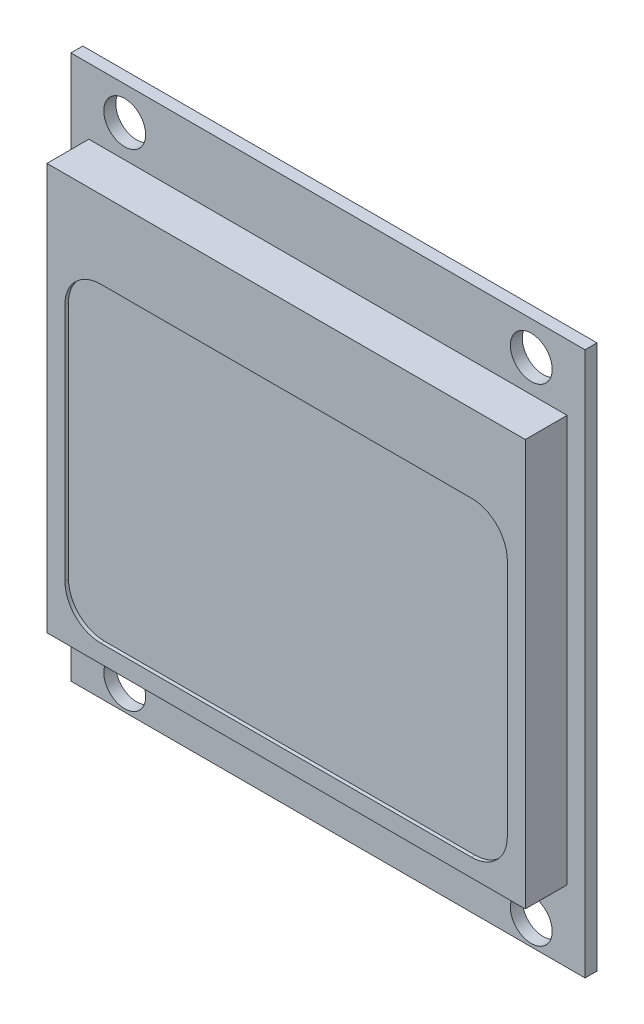
ISO-10303-21;
HEADER;
FILE_DESCRIPTION(('STEP AP214'),'2;1');
FILE_NAME('part.step','',(''),(''),'','','');
FILE_SCHEMA(('AUTOMOTIVE_DESIGN { 1 0 10303 214 1 1 1 1 }'));
ENDSEC;
DATA;
#1=APPLICATION_CONTEXT('core data for automotive mechanical design processes');
#2=APPLICATION_PROTOCOL_DEFINITION('international standard','automotive_design',2000,#1);
#3=PRODUCT_CONTEXT('',#1,'mechanical');
#4=PRODUCT('Part','Part','',(#3));
#5=PRODUCT_RELATED_PRODUCT_CATEGORY('part','',(#4));
#6=PRODUCT_DEFINITION_FORMATION('','',#4);
#7=PRODUCT_DEFINITION_CONTEXT('part definition',#1,'design');
#8=PRODUCT_DEFINITION('design','',#6,#7);
#9=PRODUCT_DEFINITION_SHAPE('','',#8);
#10=(LENGTH_UNIT() NAMED_UNIT(*) SI_UNIT(.MILLI.,.METRE.));
#11=(NAMED_UNIT(*) PLANE_ANGLE_UNIT() SI_UNIT($,.RADIAN.));
#12=(NAMED_UNIT(*) SI_UNIT($,.STERADIAN.) SOLID_ANGLE_UNIT());
#13=UNCERTAINTY_MEASURE_WITH_UNIT(LENGTH_MEASURE(1.E-05),#10,'distance_accuracy_value','');
#14=(GEOMETRIC_REPRESENTATION_CONTEXT(3) GLOBAL_UNCERTAINTY_ASSIGNED_CONTEXT((#13)) GLOBAL_UNIT_ASSIGNED_CONTEXT((#10,
#11,#12)) REPRESENTATION_CONTEXT('',''));
#15=CARTESIAN_POINT('',(0.,0.,0.));
#16=DIRECTION('',(0.,0.,1.));
#17=DIRECTION('',(1.,0.,0.));
#18=AXIS2_PLACEMENT_3D('',#15,#16,#17);
#19=CARTESIAN_POINT('',(0.,0.,1.));
#20=DIRECTION('',(0.,0.,1.));
#21=DIRECTION('',(1.,0.,0.));
#22=AXIS2_PLACEMENT_3D('',#19,#20,#21);
#23=PLANE('',#22);
#24=CARTESIAN_POINT('',(-17.,-20.75,1.));
#25=DIRECTION('',(0.,0.,1.));
#26=DIRECTION('',(1.,0.,0.));
#27=AXIS2_PLACEMENT_3D('',#24,#25,#26);
#28=CIRCLE('',#27,1.75);
#29=CARTESIAN_POINT('',(-15.25,-20.75,1.));
#30=VERTEX_POINT('',#29);
#31=EDGE_CURVE('E251',#30,#30,#28,.T.);
#32=ORIENTED_EDGE('',*,*,#31,.F.);
#33=EDGE_LOOP('',(#32));
#34=FACE_BOUND('',#33,.T.);
#35=CARTESIAN_POINT('',(-17.,19.95,1.));
#36=DIRECTION('',(0.,0.,1.));
#37=DIRECTION('',(1.,0.,0.));
#38=AXIS2_PLACEMENT_3D('',#35,#36,#37);
#39=CIRCLE('',#38,1.75);
#40=CARTESIAN_POINT('',(-15.25,19.95,1.));
#41=VERTEX_POINT('',#40);
#42=EDGE_CURVE('E263',#41,#41,#39,.T.);
#43=ORIENTED_EDGE('',*,*,#42,.F.);
#44=EDGE_LOOP('',(#43));
#45=FACE_BOUND('',#44,.T.);
#46=DIRECTION('',(0.,1.,0.));
#47=VECTOR('',#46,1.);
#48=CARTESIAN_POINT('',(21.5,22.75,1.));
#49=LINE('',#48,#47);
#50=CARTESIAN_POINT('',(21.5,-22.75,1.));
#51=VERTEX_POINT('',#50);
#52=CARTESIAN_POINT('',(21.5,22.75,1.));
#53=VERTEX_POINT('',#52);
#54=EDGE_CURVE('E269',#51,#53,#49,.T.);
#55=ORIENTED_EDGE('',*,*,#54,.T.);
#56=DIRECTION('',(-1.,0.,0.));
#57=VECTOR('',#56,1.);
#58=CARTESIAN_POINT('',(-21.5,22.75,1.));
#59=LINE('',#58,#57);
#60=CARTESIAN_POINT('',(-21.5,22.75,1.));
#61=VERTEX_POINT('',#60);
#62=EDGE_CURVE('E272',#53,#61,#59,.T.);
#63=ORIENTED_EDGE('',*,*,#62,.T.);
#64=DIRECTION('',(0.,-1.,0.));
#65=VECTOR('',#64,1.);
#66=CARTESIAN_POINT('',(-21.5,22.75,1.));
#67=LINE('',#66,#65);
#68=CARTESIAN_POINT('',(-21.5,-22.75,1.));
#69=VERTEX_POINT('',#68);
#70=EDGE_CURVE('E275',#61,#69,#67,.T.);
#71=ORIENTED_EDGE('',*,*,#70,.T.);
#72=DIRECTION('',(1.,0.,0.));
#73=VECTOR('',#72,1.);
#74=CARTESIAN_POINT('',(-21.5,-22.75,1.));
#75=LINE('',#74,#73);
#76=EDGE_CURVE('E277',#69,#51,#75,.T.);
#77=ORIENTED_EDGE('',*,*,#76,.T.);
#78=EDGE_LOOP('',(#55,#63,#71,#77));
#79=FACE_BOUND('',#78,.T.);
#80=CARTESIAN_POINT('',(17.,19.95,1.));
#81=DIRECTION('',(0.,0.,1.));
#82=DIRECTION('',(1.,0.,0.));
#83=AXIS2_PLACEMENT_3D('',#80,#81,#82);
#84=CIRCLE('',#83,1.75);
#85=CARTESIAN_POINT('',(18.75,19.95,1.));
#86=VERTEX_POINT('',#85);
#87=EDGE_CURVE('E257',#86,#86,#84,.T.);
#88=ORIENTED_EDGE('',*,*,#87,.F.);
#89=EDGE_LOOP('',(#88));
#90=FACE_BOUND('',#89,.T.);
#91=CARTESIAN_POINT('',(17.,-20.75,1.));
#92=DIRECTION('',(0.,0.,1.));
#93=DIRECTION('',(1.,0.,0.));
#94=AXIS2_PLACEMENT_3D('',#91,#92,#93);
#95=CIRCLE('',#94,1.75);
#96=CARTESIAN_POINT('',(18.75,-20.75,1.));
#97=VERTEX_POINT('',#96);
#98=EDGE_CURVE('E245',#97,#97,#95,.T.);
#99=ORIENTED_EDGE('',*,*,#98,.F.);
#100=EDGE_LOOP('',(#99));
#101=FACE_BOUND('',#100,.T.);
#102=DIRECTION('',(-1.,0.,0.));
#103=VECTOR('',#102,1.);
#104=CARTESIAN_POINT('',(-20.,17.25,1.));
#105=LINE('',#104,#103);
#106=CARTESIAN_POINT('',(20.,17.25,1.));
#107=VERTEX_POINT('',#106);
#108=CARTESIAN_POINT('',(-20.,17.25,1.));
#109=VERTEX_POINT('',#108);
#110=EDGE_CURVE('E231',#107,#109,#105,.T.);
#111=ORIENTED_EDGE('',*,*,#110,.F.);
#112=DIRECTION('',(0.,1.,0.));
#113=VECTOR('',#112,1.);
#114=CARTESIAN_POINT('',(20.,17.25,1.));
#115=LINE('',#114,#113);
#116=CARTESIAN_POINT('',(20.,-16.75,1.));
#117=VERTEX_POINT('',#116);
#118=EDGE_CURVE('E206',#117,#107,#115,.T.);
#119=ORIENTED_EDGE('',*,*,#118,.F.);
#120=DIRECTION('',(1.,0.,0.));
#121=VECTOR('',#120,1.);
#122=CARTESIAN_POINT('',(-20.,-16.75,1.));
#123=LINE('',#122,#121);
#124=CARTESIAN_POINT('',(-20.,-16.75,1.));
#125=VERTEX_POINT('',#124);
#126=EDGE_CURVE('E222',#125,#117,#123,.T.);
#127=ORIENTED_EDGE('',*,*,#126,.F.);
#128=DIRECTION('',(0.,-1.,0.));
#129=VECTOR('',#128,1.);
#130=CARTESIAN_POINT('',(-20.,17.25,1.));
#131=LINE('',#130,#129);
#132=EDGE_CURVE('E233',#109,#125,#131,.T.);
#133=ORIENTED_EDGE('',*,*,#132,.F.);
#134=EDGE_LOOP('',(#111,#119,#127,#133));
#135=FACE_BOUND('',#134,.T.);
#136=ADVANCED_FACE('F33',(#34,#45,#79,#90,#101,#135),#23,.T.);
#137=CARTESIAN_POINT('',(0.,0.,0.));
#138=DIRECTION('',(0.,0.,1.));
#139=DIRECTION('',(1.,0.,0.));
#140=AXIS2_PLACEMENT_3D('',#137,#138,#139);
#141=PLANE('',#140);
#142=DIRECTION('',(0.,1.,0.));
#143=VECTOR('',#142,1.);
#144=CARTESIAN_POINT('',(21.5,22.75,0.));
#145=LINE('',#144,#143);
#146=CARTESIAN_POINT('',(21.5,-22.75,0.));
#147=VERTEX_POINT('',#146);
#148=CARTESIAN_POINT('',(21.5,22.75,0.));
#149=VERTEX_POINT('',#148);
#150=EDGE_CURVE('E266',#147,#149,#145,.T.);
#151=ORIENTED_EDGE('',*,*,#150,.F.);
#152=DIRECTION('',(1.,0.,0.));
#153=VECTOR('',#152,1.);
#154=CARTESIAN_POINT('',(-21.5,-22.75,0.));
#155=LINE('',#154,#153);
#156=CARTESIAN_POINT('',(-21.5,-22.75,0.));
#157=VERTEX_POINT('',#156);
#158=EDGE_CURVE('E273',#157,#147,#155,.T.);
#159=ORIENTED_EDGE('',*,*,#158,.F.);
#160=DIRECTION('',(0.,-1.,0.));
#161=VECTOR('',#160,1.);
#162=CARTESIAN_POINT('',(-21.5,22.75,0.));
#163=LINE('',#162,#161);
#164=CARTESIAN_POINT('',(-21.5,22.75,0.));
#165=VERTEX_POINT('',#164);
#166=EDGE_CURVE('E284',#165,#157,#163,.T.);
#167=ORIENTED_EDGE('',*,*,#166,.F.);
#168=DIRECTION('',(-1.,0.,0.));
#169=VECTOR('',#168,1.);
#170=CARTESIAN_POINT('',(-21.5,22.75,0.));
#171=LINE('',#170,#169);
#172=EDGE_CURVE('E282',#149,#165,#171,.T.);
#173=ORIENTED_EDGE('',*,*,#172,.F.);
#174=EDGE_LOOP('',(#151,#159,#167,#173));
#175=FACE_BOUND('',#174,.T.);
#176=CARTESIAN_POINT('',(-17.,19.95,0.));
#177=DIRECTION('',(0.,0.,1.));
#178=DIRECTION('',(1.,0.,0.));
#179=AXIS2_PLACEMENT_3D('',#176,#177,#178);
#180=CIRCLE('',#179,1.75);
#181=CARTESIAN_POINT('',(-15.25,19.95,0.));
#182=VERTEX_POINT('',#181);
#183=EDGE_CURVE('E260',#182,#182,#180,.T.);
#184=ORIENTED_EDGE('',*,*,#183,.T.);
#185=EDGE_LOOP('',(#184));
#186=FACE_BOUND('',#185,.T.);
#187=CARTESIAN_POINT('',(17.,19.95,0.));
#188=DIRECTION('',(0.,0.,1.));
#189=DIRECTION('',(1.,0.,0.));
#190=AXIS2_PLACEMENT_3D('',#187,#188,#189);
#191=CIRCLE('',#190,1.75);
#192=CARTESIAN_POINT('',(18.75,19.95,0.));
#193=VERTEX_POINT('',#192);
#194=EDGE_CURVE('E254',#193,#193,#191,.T.);
#195=ORIENTED_EDGE('',*,*,#194,.T.);
#196=EDGE_LOOP('',(#195));
#197=FACE_BOUND('',#196,.T.);
#198=CARTESIAN_POINT('',(-17.,-20.75,0.));
#199=DIRECTION('',(0.,0.,1.));
#200=DIRECTION('',(1.,0.,0.));
#201=AXIS2_PLACEMENT_3D('',#198,#199,#200);
#202=CIRCLE('',#201,1.75);
#203=CARTESIAN_POINT('',(-15.25,-20.75,0.));
#204=VERTEX_POINT('',#203);
#205=EDGE_CURVE('E248',#204,#204,#202,.T.);
#206=ORIENTED_EDGE('',*,*,#205,.T.);
#207=EDGE_LOOP('',(#206));
#208=FACE_BOUND('',#207,.T.);
#209=CARTESIAN_POINT('',(17.,-20.75,0.));
#210=DIRECTION('',(0.,0.,1.));
#211=DIRECTION('',(1.,0.,0.));
#212=AXIS2_PLACEMENT_3D('',#209,#210,#211);
#213=CIRCLE('',#212,1.75);
#214=CARTESIAN_POINT('',(18.75,-20.75,0.));
#215=VERTEX_POINT('',#214);
#216=EDGE_CURVE('E244',#215,#215,#213,.T.);
#217=ORIENTED_EDGE('',*,*,#216,.T.);
#218=EDGE_LOOP('',(#217));
#219=FACE_BOUND('',#218,.T.);
#220=ADVANCED_FACE('F302',(#175,#186,#197,#208,#219),#141,.F.);
#221=CARTESIAN_POINT('',(21.5,22.75,1.));
#222=DIRECTION('',(-1.,0.,0.));
#223=DIRECTION('',(0.,-1.,0.));
#224=AXIS2_PLACEMENT_3D('',#221,#222,#223);
#225=PLANE('',#224);
#226=ORIENTED_EDGE('',*,*,#150,.T.);
#227=DIRECTION('',(0.,0.,-1.));
#228=VECTOR('',#227,1.);
#229=CARTESIAN_POINT('',(21.5,22.75,1.));
#230=LINE('',#229,#228);
#231=EDGE_CURVE('E11',#53,#149,#230,.T.);
#232=ORIENTED_EDGE('',*,*,#231,.F.);
#233=ORIENTED_EDGE('',*,*,#54,.F.);
#234=DIRECTION('',(0.,0.,-1.));
#235=VECTOR('',#234,1.);
#236=CARTESIAN_POINT('',(21.5,-22.75,1.));
#237=LINE('',#236,#235);
#238=EDGE_CURVE('E279',#51,#147,#237,.T.);
#239=ORIENTED_EDGE('',*,*,#238,.T.);
#240=EDGE_LOOP('',(#226,#232,#233,#239));
#241=FACE_BOUND('',#240,.T.);
#242=ADVANCED_FACE('F35',(#241),#225,.F.);
#243=CARTESIAN_POINT('',(-21.5,22.75,1.));
#244=DIRECTION('',(0.,-1.,0.));
#245=DIRECTION('',(0.,0.,-1.));
#246=AXIS2_PLACEMENT_3D('',#243,#244,#245);
#247=PLANE('',#246);
#248=ORIENTED_EDGE('',*,*,#172,.T.);
#249=DIRECTION('',(0.,0.,-1.));
#250=VECTOR('',#249,1.);
#251=CARTESIAN_POINT('',(-21.5,22.75,1.));
#252=LINE('',#251,#250);
#253=EDGE_CURVE('E41',#61,#165,#252,.T.);
#254=ORIENTED_EDGE('',*,*,#253,.F.);
#255=ORIENTED_EDGE('',*,*,#62,.F.);
#256=ORIENTED_EDGE('',*,*,#231,.T.);
#257=EDGE_LOOP('',(#248,#254,#255,#256));
#258=FACE_BOUND('',#257,.T.);
#259=ADVANCED_FACE('F313',(#258),#247,.F.);
#260=CARTESIAN_POINT('',(-21.5,22.75,1.));
#261=DIRECTION('',(1.,0.,0.));
#262=DIRECTION('',(0.,1.,0.));
#263=AXIS2_PLACEMENT_3D('',#260,#261,#262);
#264=PLANE('',#263);
#265=ORIENTED_EDGE('',*,*,#166,.T.);
#266=DIRECTION('',(0.,0.,-1.));
#267=VECTOR('',#266,1.);
#268=CARTESIAN_POINT('',(-21.5,-22.75,1.));
#269=LINE('',#268,#267);
#270=EDGE_CURVE('E289',#69,#157,#269,.T.);
#271=ORIENTED_EDGE('',*,*,#270,.F.);
#272=ORIENTED_EDGE('',*,*,#70,.F.);
#273=ORIENTED_EDGE('',*,*,#253,.T.);
#274=EDGE_LOOP('',(#265,#271,#272,#273));
#275=FACE_BOUND('',#274,.T.);
#276=ADVANCED_FACE('F296',(#275),#264,.F.);
#277=CARTESIAN_POINT('',(-21.5,-22.75,1.));
#278=DIRECTION('',(0.,1.,0.));
#279=DIRECTION('',(0.,0.,1.));
#280=AXIS2_PLACEMENT_3D('',#277,#278,#279);
#281=PLANE('',#280);
#282=ORIENTED_EDGE('',*,*,#158,.T.);
#283=ORIENTED_EDGE('',*,*,#238,.F.);
#284=ORIENTED_EDGE('',*,*,#76,.F.);
#285=ORIENTED_EDGE('',*,*,#270,.T.);
#286=EDGE_LOOP('',(#282,#283,#284,#285));
#287=FACE_BOUND('',#286,.T.);
#288=ADVANCED_FACE('F306',(#287),#281,.F.);
#289=CARTESIAN_POINT('',(-17.,19.95,1.));
#290=DIRECTION('',(0.,0.,-1.));
#291=DIRECTION('',(-1.,0.,0.));
#292=AXIS2_PLACEMENT_3D('',#289,#290,#291);
#293=CYLINDRICAL_SURFACE('',#292,1.75);
#294=ORIENTED_EDGE('',*,*,#42,.T.);
#295=EDGE_LOOP('',(#294));
#296=FACE_BOUND('',#295,.T.);
#297=ORIENTED_EDGE('',*,*,#183,.F.);
#298=EDGE_LOOP('',(#297));
#299=FACE_BOUND('',#298,.T.);
#300=ADVANCED_FACE('F330',(#296,#299),#293,.F.);
#301=CARTESIAN_POINT('',(17.,19.95,1.));
#302=DIRECTION('',(0.,0.,-1.));
#303=DIRECTION('',(-1.,0.,0.));
#304=AXIS2_PLACEMENT_3D('',#301,#302,#303);
#305=CYLINDRICAL_SURFACE('',#304,1.75);
#306=ORIENTED_EDGE('',*,*,#87,.T.);
#307=EDGE_LOOP('',(#306));
#308=FACE_BOUND('',#307,.T.);
#309=ORIENTED_EDGE('',*,*,#194,.F.);
#310=EDGE_LOOP('',(#309));
#311=FACE_BOUND('',#310,.T.);
#312=ADVANCED_FACE('F337',(#308,#311),#305,.F.);
#313=CARTESIAN_POINT('',(-17.,-20.75,1.));
#314=DIRECTION('',(0.,0.,-1.));
#315=DIRECTION('',(-1.,0.,0.));
#316=AXIS2_PLACEMENT_3D('',#313,#314,#315);
#317=CYLINDRICAL_SURFACE('',#316,1.75);
#318=ORIENTED_EDGE('',*,*,#31,.T.);
#319=EDGE_LOOP('',(#318));
#320=FACE_BOUND('',#319,.T.);
#321=ORIENTED_EDGE('',*,*,#205,.F.);
#322=EDGE_LOOP('',(#321));
#323=FACE_BOUND('',#322,.T.);
#324=ADVANCED_FACE('F342',(#320,#323),#317,.F.);
#325=CARTESIAN_POINT('',(17.,-20.75,1.));
#326=DIRECTION('',(0.,0.,-1.));
#327=DIRECTION('',(-1.,0.,0.));
#328=AXIS2_PLACEMENT_3D('',#325,#326,#327);
#329=CYLINDRICAL_SURFACE('',#328,1.75);
#330=ORIENTED_EDGE('',*,*,#98,.T.);
#331=EDGE_LOOP('',(#330));
#332=FACE_BOUND('',#331,.T.);
#333=ORIENTED_EDGE('',*,*,#216,.F.);
#334=EDGE_LOOP('',(#333));
#335=FACE_BOUND('',#334,.T.);
#336=ADVANCED_FACE('F354',(#332,#335),#329,.F.);
#337=CARTESIAN_POINT('',(20.,17.25,4.5));
#338=DIRECTION('',(-1.,0.,0.));
#339=DIRECTION('',(0.,-1.,0.));
#340=AXIS2_PLACEMENT_3D('',#337,#338,#339);
#341=PLANE('',#340);
#342=ORIENTED_EDGE('',*,*,#118,.T.);
#343=DIRECTION('',(0.,0.,-1.));
#344=VECTOR('',#343,1.);
#345=CARTESIAN_POINT('',(20.,17.25,4.5));
#346=LINE('',#345,#344);
#347=CARTESIAN_POINT('',(20.,17.25,4.5));
#348=VERTEX_POINT('',#347);
#349=EDGE_CURVE('E242',#348,#107,#346,.T.);
#350=ORIENTED_EDGE('',*,*,#349,.F.);
#351=DIRECTION('',(0.,1.,0.));
#352=VECTOR('',#351,1.);
#353=CARTESIAN_POINT('',(20.,17.25,4.5));
#354=LINE('',#353,#352);
#355=CARTESIAN_POINT('',(20.,-16.75,4.5));
#356=VERTEX_POINT('',#355);
#357=EDGE_CURVE('E218',#356,#348,#354,.T.);
#358=ORIENTED_EDGE('',*,*,#357,.F.);
#359=DIRECTION('',(0.,0.,-1.));
#360=VECTOR('',#359,1.);
#361=CARTESIAN_POINT('',(20.,-16.75,4.5));
#362=LINE('',#361,#360);
#363=EDGE_CURVE('E228',#356,#117,#362,.T.);
#364=ORIENTED_EDGE('',*,*,#363,.T.);
#365=EDGE_LOOP('',(#342,#350,#358,#364));
#366=FACE_BOUND('',#365,.T.);
#367=ADVANCED_FACE('F356',(#366),#341,.F.);
#368=CARTESIAN_POINT('',(-20.,17.25,4.5));
#369=DIRECTION('',(0.,-1.,0.));
#370=DIRECTION('',(0.,0.,-1.));
#371=AXIS2_PLACEMENT_3D('',#368,#369,#370);
#372=PLANE('',#371);
#373=ORIENTED_EDGE('',*,*,#110,.T.);
#374=DIRECTION('',(0.,0.,-1.));
#375=VECTOR('',#374,1.);
#376=CARTESIAN_POINT('',(-20.,17.25,4.5));
#377=LINE('',#376,#375);
#378=CARTESIAN_POINT('',(-20.,17.25,4.5));
#379=VERTEX_POINT('',#378);
#380=EDGE_CURVE('E239',#379,#109,#377,.T.);
#381=ORIENTED_EDGE('',*,*,#380,.F.);
#382=DIRECTION('',(-1.,0.,0.));
#383=VECTOR('',#382,1.);
#384=CARTESIAN_POINT('',(-20.,17.25,4.5));
#385=LINE('',#384,#383);
#386=EDGE_CURVE('E221',#348,#379,#385,.T.);
#387=ORIENTED_EDGE('',*,*,#386,.F.);
#388=ORIENTED_EDGE('',*,*,#349,.T.);
#389=EDGE_LOOP('',(#373,#381,#387,#388));
#390=FACE_BOUND('',#389,.T.);
#391=ADVANCED_FACE('F363',(#390),#372,.F.);
#392=CARTESIAN_POINT('',(-20.,17.25,4.5));
#393=DIRECTION('',(1.,0.,0.));
#394=DIRECTION('',(0.,1.,0.));
#395=AXIS2_PLACEMENT_3D('',#392,#393,#394);
#396=PLANE('',#395);
#397=ORIENTED_EDGE('',*,*,#132,.T.);
#398=DIRECTION('',(0.,0.,-1.));
#399=VECTOR('',#398,1.);
#400=CARTESIAN_POINT('',(-20.,-16.75,4.5));
#401=LINE('',#400,#399);
#402=CARTESIAN_POINT('',(-20.,-16.75,4.5));
#403=VERTEX_POINT('',#402);
#404=EDGE_CURVE('E56',#403,#125,#401,.T.);
#405=ORIENTED_EDGE('',*,*,#404,.F.);
#406=DIRECTION('',(0.,-1.,0.));
#407=VECTOR('',#406,1.);
#408=CARTESIAN_POINT('',(-20.,17.25,4.5));
#409=LINE('',#408,#407);
#410=EDGE_CURVE('E224',#379,#403,#409,.T.);
#411=ORIENTED_EDGE('',*,*,#410,.F.);
#412=ORIENTED_EDGE('',*,*,#380,.T.);
#413=EDGE_LOOP('',(#397,#405,#411,#412));
#414=FACE_BOUND('',#413,.T.);
#415=ADVANCED_FACE('F371',(#414),#396,.F.);
#416=CARTESIAN_POINT('',(-20.,-16.75,4.5));
#417=DIRECTION('',(0.,1.,0.));
#418=DIRECTION('',(0.,0.,1.));
#419=AXIS2_PLACEMENT_3D('',#416,#417,#418);
#420=PLANE('',#419);
#421=ORIENTED_EDGE('',*,*,#126,.T.);
#422=ORIENTED_EDGE('',*,*,#363,.F.);
#423=DIRECTION('',(1.,0.,0.));
#424=VECTOR('',#423,1.);
#425=CARTESIAN_POINT('',(-20.,-16.75,4.5));
#426=LINE('',#425,#424);
#427=EDGE_CURVE('E226',#403,#356,#426,.T.);
#428=ORIENTED_EDGE('',*,*,#427,.F.);
#429=ORIENTED_EDGE('',*,*,#404,.T.);
#430=EDGE_LOOP('',(#421,#422,#428,#429));
#431=FACE_BOUND('',#430,.T.);
#432=ADVANCED_FACE('F375',(#431),#420,.F.);
#433=CARTESIAN_POINT('',(0.,0.,4.5));
#434=DIRECTION('',(0.,0.,1.));
#435=DIRECTION('',(1.,0.,0.));
#436=AXIS2_PLACEMENT_3D('',#433,#434,#435);
#437=PLANE('',#436);
#438=CARTESIAN_POINT('',(-15.5,-12.25,4.5));
#439=DIRECTION('',(0.,0.,1.));
#440=DIRECTION('',(1.,0.,0.));
#441=AXIS2_PLACEMENT_3D('',#438,#439,#440);
#442=CIRCLE('',#441,3.);
#443=CARTESIAN_POINT('',(-18.5,-12.25,4.5));
#444=VERTEX_POINT('',#443);
#445=CARTESIAN_POINT('',(-15.5,-15.25,4.5));
#446=VERTEX_POINT('',#445);
#447=EDGE_CURVE('E48',#444,#446,#442,.T.);
#448=ORIENTED_EDGE('',*,*,#447,.F.);
#449=DIRECTION('',(0.,-1.,0.));
#450=VECTOR('',#449,1.);
#451=CARTESIAN_POINT('',(-18.5,7.74999999999998,4.5));
#452=LINE('',#451,#450);
#453=CARTESIAN_POINT('',(-18.5,7.74999999999998,4.5));
#454=VERTEX_POINT('',#453);
#455=EDGE_CURVE('E168',#454,#444,#452,.T.);
#456=ORIENTED_EDGE('',*,*,#455,.F.);
#457=CARTESIAN_POINT('',(-15.5,7.75,4.5));
#458=DIRECTION('',(0.,0.,1.));
#459=DIRECTION('',(1.,0.,0.));
#460=AXIS2_PLACEMENT_3D('',#457,#458,#459);
#461=CIRCLE('',#460,3.);
#462=CARTESIAN_POINT('',(-15.5,10.75,4.5));
#463=VERTEX_POINT('',#462);
#464=EDGE_CURVE('E171',#463,#454,#461,.T.);
#465=ORIENTED_EDGE('',*,*,#464,.F.);
#466=DIRECTION('',(-1.,0.,0.));
#467=VECTOR('',#466,1.);
#468=CARTESIAN_POINT('',(-15.5,10.75,4.5));
#469=LINE('',#468,#467);
#470=CARTESIAN_POINT('',(15.5,10.75,4.5));
#471=VERTEX_POINT('',#470);
#472=EDGE_CURVE('E199',#471,#463,#469,.T.);
#473=ORIENTED_EDGE('',*,*,#472,.F.);
#474=CARTESIAN_POINT('',(15.5,7.75,4.5));
#475=DIRECTION('',(0.,0.,1.));
#476=DIRECTION('',(-1.,0.,0.));
#477=AXIS2_PLACEMENT_3D('',#474,#475,#476);
#478=CIRCLE('',#477,3.);
#479=CARTESIAN_POINT('',(18.5,7.74999999999998,4.5));
#480=VERTEX_POINT('',#479);
#481=EDGE_CURVE('E196',#480,#471,#478,.T.);
#482=ORIENTED_EDGE('',*,*,#481,.F.);
#483=DIRECTION('',(0.,1.,0.));
#484=VECTOR('',#483,1.);
#485=CARTESIAN_POINT('',(18.5,7.74999999999998,4.5));
#486=LINE('',#485,#484);
#487=CARTESIAN_POINT('',(18.5,-12.25,4.5));
#488=VERTEX_POINT('',#487);
#489=EDGE_CURVE('E193',#488,#480,#486,.T.);
#490=ORIENTED_EDGE('',*,*,#489,.F.);
#491=CARTESIAN_POINT('',(15.5,-12.25,4.5));
#492=DIRECTION('',(0.,0.,1.));
#493=DIRECTION('',(1.,0.,0.));
#494=AXIS2_PLACEMENT_3D('',#491,#492,#493);
#495=CIRCLE('',#494,3.);
#496=CARTESIAN_POINT('',(15.5,-15.25,4.5));
#497=VERTEX_POINT('',#496);
#498=EDGE_CURVE('E190',#497,#488,#495,.T.);
#499=ORIENTED_EDGE('',*,*,#498,.F.);
#500=DIRECTION('',(1.,0.,0.));
#501=VECTOR('',#500,1.);
#502=CARTESIAN_POINT('',(-15.5,-15.25,4.5));
#503=LINE('',#502,#501);
#504=EDGE_CURVE('E188',#446,#497,#503,.T.);
#505=ORIENTED_EDGE('',*,*,#504,.F.);
#506=EDGE_LOOP('',(#448,#456,#465,#473,#482,#490,#499,#505));
#507=FACE_BOUND('',#506,.T.);
#508=ORIENTED_EDGE('',*,*,#357,.T.);
#509=ORIENTED_EDGE('',*,*,#386,.T.);
#510=ORIENTED_EDGE('',*,*,#410,.T.);
#511=ORIENTED_EDGE('',*,*,#427,.T.);
#512=EDGE_LOOP('',(#508,#509,#510,#511));
#513=FACE_BOUND('',#512,.T.);
#514=ADVANCED_FACE('F379',(#507,#513),#437,.T.);
#515=CARTESIAN_POINT('',(-15.5,-12.25,4.2));
#516=DIRECTION('',(0.,0.,1.));
#517=DIRECTION('',(1.,0.,0.));
#518=AXIS2_PLACEMENT_3D('',#515,#516,#517);
#519=CYLINDRICAL_SURFACE('',#518,3.);
#520=ORIENTED_EDGE('',*,*,#447,.T.);
#521=DIRECTION('',(0.,0.,1.));
#522=VECTOR('',#521,1.);
#523=CARTESIAN_POINT('',(-15.5,-15.25,4.2));
#524=LINE('',#523,#522);
#525=CARTESIAN_POINT('',(-15.5,-15.25,4.2));
#526=VERTEX_POINT('',#525);
#527=EDGE_CURVE('E145',#526,#446,#524,.T.);
#528=ORIENTED_EDGE('',*,*,#527,.F.);
#529=CARTESIAN_POINT('',(-15.5,-12.25,4.2));
#530=DIRECTION('',(0.,0.,1.));
#531=DIRECTION('',(1.,0.,0.));
#532=AXIS2_PLACEMENT_3D('',#529,#530,#531);
#533=CIRCLE('',#532,3.);
#534=CARTESIAN_POINT('',(-18.5,-12.25,4.2));
#535=VERTEX_POINT('',#534);
#536=EDGE_CURVE('E149',#535,#526,#533,.T.);
#537=ORIENTED_EDGE('',*,*,#536,.F.);
#538=DIRECTION('',(0.,0.,1.));
#539=VECTOR('',#538,1.);
#540=CARTESIAN_POINT('',(-18.5,-12.25,4.2));
#541=LINE('',#540,#539);
#542=EDGE_CURVE('E204',#535,#444,#541,.T.);
#543=ORIENTED_EDGE('',*,*,#542,.T.);
#544=EDGE_LOOP('',(#520,#528,#537,#543));
#545=FACE_BOUND('',#544,.T.);
#546=ADVANCED_FACE('F147',(#545),#519,.F.);
#547=CARTESIAN_POINT('',(-18.5,7.74999999999998,4.2));
#548=DIRECTION('',(-1.,0.,0.));
#549=DIRECTION('',(0.,-1.,0.));
#550=AXIS2_PLACEMENT_3D('',#547,#548,#549);
#551=PLANE('',#550);
#552=ORIENTED_EDGE('',*,*,#455,.T.);
#553=ORIENTED_EDGE('',*,*,#542,.F.);
#554=DIRECTION('',(0.,-1.,0.));
#555=VECTOR('',#554,1.);
#556=CARTESIAN_POINT('',(-18.5,7.74999999999998,4.2));
#557=LINE('',#556,#555);
#558=CARTESIAN_POINT('',(-18.5,7.74999999999998,4.2));
#559=VERTEX_POINT('',#558);
#560=EDGE_CURVE('E155',#559,#535,#557,.T.);
#561=ORIENTED_EDGE('',*,*,#560,.F.);
#562=DIRECTION('',(0.,0.,1.));
#563=VECTOR('',#562,1.);
#564=CARTESIAN_POINT('',(-18.5,7.74999999999998,4.2));
#565=LINE('',#564,#563);
#566=EDGE_CURVE('E207',#559,#454,#565,.T.);
#567=ORIENTED_EDGE('',*,*,#566,.T.);
#568=EDGE_LOOP('',(#552,#553,#561,#567));
#569=FACE_BOUND('',#568,.T.);
#570=ADVANCED_FACE('F385',(#569),#551,.F.);
#571=CARTESIAN_POINT('',(-15.5,7.75,4.2));
#572=DIRECTION('',(0.,0.,1.));
#573=DIRECTION('',(1.,0.,0.));
#574=AXIS2_PLACEMENT_3D('',#571,#572,#573);
#575=CYLINDRICAL_SURFACE('',#574,3.);
#576=ORIENTED_EDGE('',*,*,#464,.T.);
#577=ORIENTED_EDGE('',*,*,#566,.F.);
#578=CARTESIAN_POINT('',(-15.5,7.75,4.2));
#579=DIRECTION('',(0.,0.,1.));
#580=DIRECTION('',(1.,0.,0.));
#581=AXIS2_PLACEMENT_3D('',#578,#579,#580);
#582=CIRCLE('',#581,3.);
#583=CARTESIAN_POINT('',(-15.5,10.75,4.2));
#584=VERTEX_POINT('',#583);
#585=EDGE_CURVE('E184',#584,#559,#582,.T.);
#586=ORIENTED_EDGE('',*,*,#585,.F.);
#587=DIRECTION('',(0.,0.,1.));
#588=VECTOR('',#587,1.);
#589=CARTESIAN_POINT('',(-15.5,10.75,4.2));
#590=LINE('',#589,#588);
#591=EDGE_CURVE('E209',#584,#463,#590,.T.);
#592=ORIENTED_EDGE('',*,*,#591,.T.);
#593=EDGE_LOOP('',(#576,#577,#586,#592));
#594=FACE_BOUND('',#593,.T.);
#595=ADVANCED_FACE('F403',(#594),#575,.F.);
#596=CARTESIAN_POINT('',(-15.5,10.75,4.2));
#597=DIRECTION('',(0.,1.,0.));
#598=DIRECTION('',(0.,0.,1.));
#599=AXIS2_PLACEMENT_3D('',#596,#597,#598);
#600=PLANE('',#599);
#601=ORIENTED_EDGE('',*,*,#472,.T.);
#602=ORIENTED_EDGE('',*,*,#591,.F.);
#603=DIRECTION('',(-1.,0.,0.));
#604=VECTOR('',#603,1.);
#605=CARTESIAN_POINT('',(-15.5,10.75,4.2));
#606=LINE('',#605,#604);
#607=CARTESIAN_POINT('',(15.5,10.75,4.2));
#608=VERTEX_POINT('',#607);
#609=EDGE_CURVE('E181',#608,#584,#606,.T.);
#610=ORIENTED_EDGE('',*,*,#609,.F.);
#611=DIRECTION('',(0.,0.,1.));
#612=VECTOR('',#611,1.);
#613=CARTESIAN_POINT('',(15.5,10.75,4.2));
#614=LINE('',#613,#612);
#615=EDGE_CURVE('E211',#608,#471,#614,.T.);
#616=ORIENTED_EDGE('',*,*,#615,.T.);
#617=EDGE_LOOP('',(#601,#602,#610,#616));
#618=FACE_BOUND('',#617,.T.);
#619=ADVANCED_FACE('F399',(#618),#600,.F.);
#620=CARTESIAN_POINT('',(15.5,7.75,4.2));
#621=DIRECTION('',(0.,0.,1.));
#622=DIRECTION('',(1.,0.,0.));
#623=AXIS2_PLACEMENT_3D('',#620,#621,#622);
#624=CYLINDRICAL_SURFACE('',#623,3.);
#625=ORIENTED_EDGE('',*,*,#481,.T.);
#626=ORIENTED_EDGE('',*,*,#615,.F.);
#627=CARTESIAN_POINT('',(15.5,7.75,4.2));
#628=DIRECTION('',(0.,0.,1.));
#629=DIRECTION('',(-1.,0.,0.));
#630=AXIS2_PLACEMENT_3D('',#627,#628,#629);
#631=CIRCLE('',#630,3.);
#632=CARTESIAN_POINT('',(18.5,7.74999999999998,4.2));
#633=VERTEX_POINT('',#632);
#634=EDGE_CURVE('E178',#633,#608,#631,.T.);
#635=ORIENTED_EDGE('',*,*,#634,.F.);
#636=DIRECTION('',(0.,0.,1.));
#637=VECTOR('',#636,1.);
#638=CARTESIAN_POINT('',(18.5,7.74999999999998,4.2));
#639=LINE('',#638,#637);
#640=EDGE_CURVE('E213',#633,#480,#639,.T.);
#641=ORIENTED_EDGE('',*,*,#640,.T.);
#642=EDGE_LOOP('',(#625,#626,#635,#641));
#643=FACE_BOUND('',#642,.T.);
#644=ADVANCED_FACE('F395',(#643),#624,.F.);
#645=CARTESIAN_POINT('',(18.5,7.74999999999998,4.2));
#646=DIRECTION('',(1.,0.,0.));
#647=DIRECTION('',(0.,1.,0.));
#648=AXIS2_PLACEMENT_3D('',#645,#646,#647);
#649=PLANE('',#648);
#650=ORIENTED_EDGE('',*,*,#489,.T.);
#651=ORIENTED_EDGE('',*,*,#640,.F.);
#652=DIRECTION('',(0.,1.,0.));
#653=VECTOR('',#652,1.);
#654=CARTESIAN_POINT('',(18.5,7.74999999999998,4.2));
#655=LINE('',#654,#653);
#656=CARTESIAN_POINT('',(18.5,-12.25,4.2));
#657=VERTEX_POINT('',#656);
#658=EDGE_CURVE('E175',#657,#633,#655,.T.);
#659=ORIENTED_EDGE('',*,*,#658,.F.);
#660=DIRECTION('',(0.,0.,1.));
#661=VECTOR('',#660,1.);
#662=CARTESIAN_POINT('',(18.5,-12.25,4.2));
#663=LINE('',#662,#661);
#664=EDGE_CURVE('E215',#657,#488,#663,.T.);
#665=ORIENTED_EDGE('',*,*,#664,.T.);
#666=EDGE_LOOP('',(#650,#651,#659,#665));
#667=FACE_BOUND('',#666,.T.);
#668=ADVANCED_FACE('F391',(#667),#649,.F.);
#669=CARTESIAN_POINT('',(15.5,-12.25,4.2));
#670=DIRECTION('',(0.,0.,1.));
#671=DIRECTION('',(1.,0.,0.));
#672=AXIS2_PLACEMENT_3D('',#669,#670,#671);
#673=CYLINDRICAL_SURFACE('',#672,3.);
#674=ORIENTED_EDGE('',*,*,#498,.T.);
#675=ORIENTED_EDGE('',*,*,#664,.F.);
#676=CARTESIAN_POINT('',(15.5,-12.25,4.2));
#677=DIRECTION('',(0.,0.,1.));
#678=DIRECTION('',(1.,0.,0.));
#679=AXIS2_PLACEMENT_3D('',#676,#677,#678);
#680=CIRCLE('',#679,3.);
#681=CARTESIAN_POINT('',(15.5,-15.25,4.2));
#682=VERTEX_POINT('',#681);
#683=EDGE_CURVE('E163',#682,#657,#680,.T.);
#684=ORIENTED_EDGE('',*,*,#683,.F.);
#685=DIRECTION('',(0.,0.,1.));
#686=VECTOR('',#685,1.);
#687=CARTESIAN_POINT('',(15.5,-15.25,4.2));
#688=LINE('',#687,#686);
#689=EDGE_CURVE('E154',#682,#497,#688,.T.);
#690=ORIENTED_EDGE('',*,*,#689,.T.);
#691=EDGE_LOOP('',(#674,#675,#684,#690));
#692=FACE_BOUND('',#691,.T.);
#693=ADVANCED_FACE('F388',(#692),#673,.F.);
#694=CARTESIAN_POINT('',(-15.5,-15.25,4.2));
#695=DIRECTION('',(0.,-1.,0.));
#696=DIRECTION('',(0.,0.,-1.));
#697=AXIS2_PLACEMENT_3D('',#694,#695,#696);
#698=PLANE('',#697);
#699=ORIENTED_EDGE('',*,*,#504,.T.);
#700=ORIENTED_EDGE('',*,*,#689,.F.);
#701=DIRECTION('',(1.,0.,0.));
#702=VECTOR('',#701,1.);
#703=CARTESIAN_POINT('',(-15.5,-15.25,4.2));
#704=LINE('',#703,#702);
#705=EDGE_CURVE('E158',#526,#682,#704,.T.);
#706=ORIENTED_EDGE('',*,*,#705,.F.);
#707=ORIENTED_EDGE('',*,*,#527,.T.);
#708=EDGE_LOOP('',(#699,#700,#706,#707));
#709=FACE_BOUND('',#708,.T.);
#710=ADVANCED_FACE('F159',(#709),#698,.F.);
#711=CARTESIAN_POINT('',(-15.5,-12.25,4.2));
#712=DIRECTION('',(0.,0.,1.));
#713=DIRECTION('',(1.,0.,0.));
#714=AXIS2_PLACEMENT_3D('',#711,#712,#713);
#715=PLANE('',#714);
#716=ORIENTED_EDGE('',*,*,#536,.T.);
#717=ORIENTED_EDGE('',*,*,#705,.T.);
#718=ORIENTED_EDGE('',*,*,#683,.T.);
#719=ORIENTED_EDGE('',*,*,#658,.T.);
#720=ORIENTED_EDGE('',*,*,#634,.T.);
#721=ORIENTED_EDGE('',*,*,#609,.T.);
#722=ORIENTED_EDGE('',*,*,#585,.T.);
#723=ORIENTED_EDGE('',*,*,#560,.T.);
#724=EDGE_LOOP('',(#716,#717,#718,#719,#720,#721,#722,#723));
#725=FACE_BOUND('',#724,.T.);
#726=ADVANCED_FACE('F165',(#725),#715,.T.);
#727=CLOSED_SHELL('',(#136,#220,#242,#259,#276,#288,#300,#312,#324,#336,#367,#391,#415,#432,
#514,#546,#570,#595,#619,#644,#668,#693,#710,#726));
#728=MANIFOLD_SOLID_BREP('B2',#727);
#729=ADVANCED_BREP_SHAPE_REPRESENTATION('',(#18,#728),#14);
#730=SHAPE_DEFINITION_REPRESENTATION(#9,#729);
ENDSEC;
END-ISO-10303-21;
